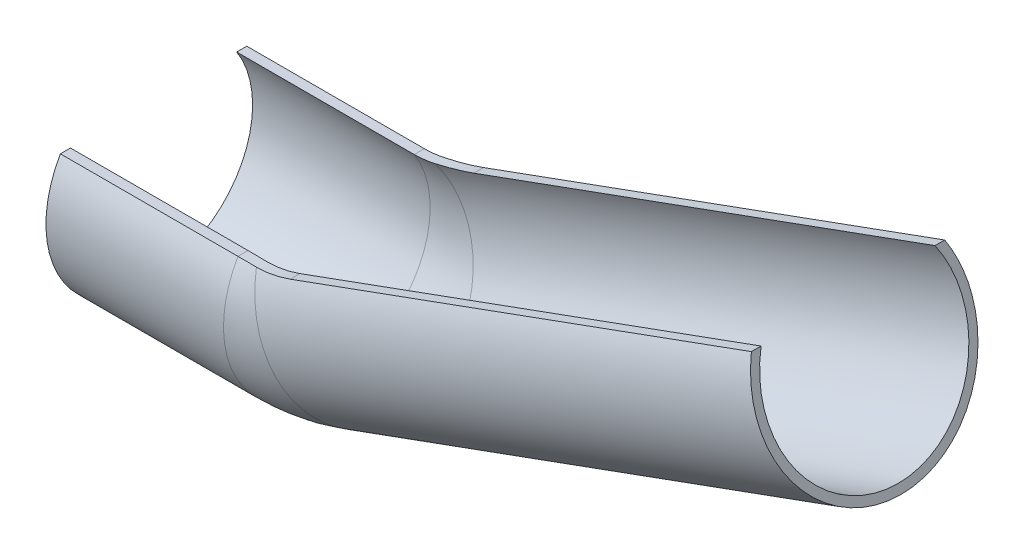
ISO-10303-21;
HEADER;
FILE_DESCRIPTION(('STEP AP214'),'2;1');
FILE_NAME('part.step','',(''),(''),'','','');
FILE_SCHEMA(('AUTOMOTIVE_DESIGN { 1 0 10303 214 1 1 1 1 }'));
ENDSEC;
DATA;
#1=APPLICATION_CONTEXT('core data for automotive mechanical design processes');
#2=APPLICATION_PROTOCOL_DEFINITION('international standard','automotive_design',2000,#1);
#3=PRODUCT_CONTEXT('',#1,'mechanical');
#4=PRODUCT('Part','Part','',(#3));
#5=PRODUCT_RELATED_PRODUCT_CATEGORY('part','',(#4));
#6=PRODUCT_DEFINITION_FORMATION('','',#4);
#7=PRODUCT_DEFINITION_CONTEXT('part definition',#1,'design');
#8=PRODUCT_DEFINITION('design','',#6,#7);
#9=PRODUCT_DEFINITION_SHAPE('','',#8);
#10=(LENGTH_UNIT() NAMED_UNIT(*) SI_UNIT(.MILLI.,.METRE.));
#11=(NAMED_UNIT(*) PLANE_ANGLE_UNIT() SI_UNIT($,.RADIAN.));
#12=(NAMED_UNIT(*) SI_UNIT($,.STERADIAN.) SOLID_ANGLE_UNIT());
#13=UNCERTAINTY_MEASURE_WITH_UNIT(LENGTH_MEASURE(1.E-05),#10,'distance_accuracy_value','');
#14=(GEOMETRIC_REPRESENTATION_CONTEXT(3) GLOBAL_UNCERTAINTY_ASSIGNED_CONTEXT((#13)) GLOBAL_UNIT_ASSIGNED_CONTEXT((#10,
#11,#12)) REPRESENTATION_CONTEXT('',''));
#15=CARTESIAN_POINT('',(0.,0.,0.));
#16=DIRECTION('',(0.,0.,1.));
#17=DIRECTION('',(1.,0.,0.));
#18=AXIS2_PLACEMENT_3D('',#15,#16,#17);
#19=CARTESIAN_POINT('',(0.,0.,0.));
#20=DIRECTION('',(1.,0.,0.));
#21=DIRECTION('',(0.,0.,-1.));
#22=AXIS2_PLACEMENT_3D('',#19,#20,#21);
#23=PLANE('',#22);
#24=DIRECTION('',(0.,0.,-1.));
#25=VECTOR('',#24,1.);
#26=CARTESIAN_POINT('',(0.,12.500000019,-41.5198482362227));
#27=LINE('',#26,#25);
#28=CARTESIAN_POINT('',(0.,12.500000019,-19.3067345330328));
#29=VERTEX_POINT('',#28);
#30=CARTESIAN_POINT('',(0.,12.500000019,-21.6506351275199));
#31=VERTEX_POINT('',#30);
#32=EDGE_CURVE('E233',#29,#31,#27,.T.);
#33=ORIENTED_EDGE('',*,*,#32,.T.);
#34=CARTESIAN_POINT('',(0.,0.,0.));
#35=DIRECTION('',(1.,0.,0.));
#36=DIRECTION('',(0.,0.,-1.));
#37=AXIS2_PLACEMENT_3D('',#34,#35,#36);
#38=CIRCLE('',#37,25.000000038);
#39=CARTESIAN_POINT('',(0.,0.,-25.000000038));
#40=VERTEX_POINT('',#39);
#41=EDGE_CURVE('E236',#40,#31,#38,.T.);
#42=ORIENTED_EDGE('',*,*,#41,.F.);
#43=CARTESIAN_POINT('',(0.,12.500000019,21.6506351275199));
#44=VERTEX_POINT('',#43);
#45=EDGE_CURVE('E249',#44,#40,#38,.T.);
#46=ORIENTED_EDGE('',*,*,#45,.F.);
#47=DIRECTION('',(0.,0.,-1.));
#48=VECTOR('',#47,1.);
#49=CARTESIAN_POINT('',(0.,12.500000019,41.5198482362227));
#50=LINE('',#49,#48);
#51=CARTESIAN_POINT('',(0.,12.500000019,19.3067345330328));
#52=VERTEX_POINT('',#51);
#53=EDGE_CURVE('E134',#44,#52,#50,.T.);
#54=ORIENTED_EDGE('',*,*,#53,.T.);
#55=CARTESIAN_POINT('',(0.,0.,0.));
#56=DIRECTION('',(1.,0.,0.));
#57=DIRECTION('',(0.,0.,-1.));
#58=AXIS2_PLACEMENT_3D('',#55,#56,#57);
#59=CIRCLE('',#58,22.999999974);
#60=EDGE_CURVE('E239',#52,#29,#59,.T.);
#61=ORIENTED_EDGE('',*,*,#60,.T.);
#62=EDGE_LOOP('',(#33,#42,#46,#54,#61));
#63=FACE_BOUND('',#62,.T.);
#64=ADVANCED_FACE('F32',(#63),#23,.F.);
#65=CARTESIAN_POINT('',(165.06096283981,43.43655820236,0.));
#66=DIRECTION('',(0.939692620785908,0.342020143325669,0.));
#67=DIRECTION('',(0.,0.,-1.));
#68=AXIS2_PLACEMENT_3D('',#65,#66,#67);
#69=PLANE('',#68);
#70=CARTESIAN_POINT('',(165.06096283981,43.43655820236,0.));
#71=DIRECTION('',(0.939692620785908,0.342020143325669,0.));
#72=DIRECTION('',(0.,0.,-1.));
#73=AXIS2_PLACEMENT_3D('',#70,#71,#72);
#74=CIRCLE('',#73,25.000000038);
#75=CARTESIAN_POINT('',(165.06096283981,43.43655820236,-25.000000038));
#76=VERTEX_POINT('',#75);
#77=CARTESIAN_POINT('',(161.301369504585,53.7659559972241,-22.453707957689));
#78=VERTEX_POINT('',#77);
#79=EDGE_CURVE('E127',#76,#78,#74,.T.);
#80=ORIENTED_EDGE('',*,*,#79,.T.);
#81=DIRECTION('',(0.,0.,1.));
#82=VECTOR('',#81,1.);
#83=CARTESIAN_POINT('',(161.301369504585,53.7659559972241,0.));
#84=LINE('',#83,#82);
#85=CARTESIAN_POINT('',(161.301369504585,53.7659559972241,-20.2031927663225));
#86=VERTEX_POINT('',#85);
#87=EDGE_CURVE('E266',#78,#86,#84,.T.);
#88=ORIENTED_EDGE('',*,*,#87,.T.);
#89=CARTESIAN_POINT('',(165.06096283981,43.43655820236,0.));
#90=DIRECTION('',(0.939692620785908,0.342020143325669,0.));
#91=DIRECTION('',(-0.342020143325669,0.939692620785908,0.));
#92=AXIS2_PLACEMENT_3D('',#89,#90,#91);
#93=CIRCLE('',#92,22.999999974);
#94=CARTESIAN_POINT('',(161.301369504585,53.7659559972241,20.2031927663225));
#95=VERTEX_POINT('',#94);
#96=EDGE_CURVE('E254',#95,#86,#93,.T.);
#97=ORIENTED_EDGE('',*,*,#96,.F.);
#98=DIRECTION('',(0.,0.,1.));
#99=VECTOR('',#98,1.);
#100=CARTESIAN_POINT('',(161.301369504585,53.7659559972241,0.));
#101=LINE('',#100,#99);
#102=CARTESIAN_POINT('',(161.301369504585,53.7659559972241,22.453707957689));
#103=VERTEX_POINT('',#102);
#104=EDGE_CURVE('E59',#95,#103,#101,.T.);
#105=ORIENTED_EDGE('',*,*,#104,.T.);
#106=EDGE_CURVE('E259',#103,#76,#74,.T.);
#107=ORIENTED_EDGE('',*,*,#106,.T.);
#108=EDGE_LOOP('',(#80,#88,#97,#105,#107));
#109=FACE_BOUND('',#108,.T.);
#110=ADVANCED_FACE('F189',(#109),#69,.T.);
#111=CARTESIAN_POINT('',(0.,0.,0.));
#112=DIRECTION('',(1.,0.,0.));
#113=DIRECTION('',(0.,0.,-1.));
#114=AXIS2_PLACEMENT_3D('',#111,#112,#113);
#115=CYLINDRICAL_SURFACE('',#114,25.000000038);
#116=ORIENTED_EDGE('',*,*,#41,.T.);
#117=DIRECTION('',(1.,0.,0.));
#118=VECTOR('',#117,1.);
#119=CARTESIAN_POINT('',(0.,12.500000019,-21.6506351275199));
#120=LINE('',#119,#118);
#121=CARTESIAN_POINT('',(41.241294690005,12.500000019,-21.6506351275199));
#122=VERTEX_POINT('',#121);
#123=EDGE_CURVE('E246',#31,#122,#120,.T.);
#124=ORIENTED_EDGE('',*,*,#123,.T.);
#125=CARTESIAN_POINT('',(41.241294690005,0.,0.));
#126=DIRECTION('',(1.,0.,0.));
#127=DIRECTION('',(0.,0.,-1.));
#128=AXIS2_PLACEMENT_3D('',#125,#126,#127);
#129=CIRCLE('',#128,25.000000038);
#130=CARTESIAN_POINT('',(41.241294690005,12.500000019,21.6506351275199));
#131=VERTEX_POINT('',#130);
#132=EDGE_CURVE('E250',#131,#122,#129,.T.);
#133=ORIENTED_EDGE('',*,*,#132,.F.);
#134=DIRECTION('',(1.,0.,0.));
#135=VECTOR('',#134,1.);
#136=CARTESIAN_POINT('',(0.,12.500000019,21.6506351275199));
#137=LINE('',#136,#135);
#138=EDGE_CURVE('E292',#131,#44,#137,.F.);
#139=ORIENTED_EDGE('',*,*,#138,.T.);
#140=ORIENTED_EDGE('',*,*,#45,.T.);
#141=EDGE_LOOP('',(#116,#124,#133,#139,#140));
#142=FACE_BOUND('',#141,.T.);
#143=ADVANCED_FACE('F228',(#142),#115,.T.);
#144=CARTESIAN_POINT('',(41.241294690005,25.4,0.));
#145=DIRECTION('',(0.,0.,1.));
#146=DIRECTION('',(1.,0.,0.));
#147=AXIS2_PLACEMENT_3D('',#144,#145,#146);
#148=TOROIDAL_SURFACE('',#147,25.4,25.000000038);
#149=ORIENTED_EDGE('',*,*,#132,.T.);
#150=CARTESIAN_POINT('',(41.241094690005,12.5000000195277,-21.6506351281104));
#151=CARTESIAN_POINT('',(41.4427943706506,12.4999985460245,-21.6506284967694));
#152=CARTESIAN_POINT('',(41.6444860700395,12.5016081439898,-21.6524350423005));
#153=CARTESIAN_POINT('',(42.0477496703757,12.5080445159722,-21.659626196609));
#154=CARTESIAN_POINT('',(42.249321574054,12.5128712135947,-21.6650107204223));
#155=CARTESIAN_POINT('',(42.8535654704319,12.5321648074768,-21.6864536078516));
#156=CARTESIAN_POINT('',(43.2559167143779,12.5514452119231,-21.7078013556818));
#157=CARTESIAN_POINT('',(44.0580307932106,12.6026826372822,-21.7635823664135));
#158=CARTESIAN_POINT('',(44.4577972597128,12.6346133675283,-21.7979884844348));
#159=CARTESIAN_POINT('',(45.2549735131758,12.710999938781,-21.8784186799537));
#160=CARTESIAN_POINT('',(45.6523831377384,12.7554566328818,-21.9244435487366));
#161=CARTESIAN_POINT('',(46.4393849390073,12.8560887766978,-22.0256735392643));
#162=CARTESIAN_POINT('',(46.8290127036205,12.9121105845886,-22.0807565465443));
#163=CARTESIAN_POINT('',(47.6051917313379,13.0360431324913,-22.1986103163941));
#164=CARTESIAN_POINT('',(47.991742981191,13.1039539236822,-22.2613811120573));
#165=CARTESIAN_POINT('',(48.7616868037057,13.2515492440647,-22.3927197126638));
#166=CARTESIAN_POINT('',(49.1450785963947,13.3312365937245,-22.4612889046268));
#167=CARTESIAN_POINT('',(49.9085195662318,13.5022732742946,-22.6023763566848));
#168=CARTESIAN_POINT('',(50.2885687152517,13.59362270324,-22.6748946499743));
#169=CARTESIAN_POINT('',(50.9653457116278,13.7673947596919,-22.8066223872954));
#170=CARTESIAN_POINT('',(51.2627208056376,13.8476288326402,-22.8654084092339));
#171=CARTESIAN_POINT('',(51.8552256671921,14.0152610495599,-22.9835939462965));
#172=CARTESIAN_POINT('',(52.1503560693851,14.102657079572,-23.0429932759018));
#173=CARTESIAN_POINT('',(52.7398874723188,14.2850716388282,-23.1620111414719));
#174=CARTESIAN_POINT('',(53.0342774177764,14.38012615066,-23.2216292854271));
#175=CARTESIAN_POINT('',(53.6208566668701,14.5774902771238,-23.3401681598754));
#176=CARTESIAN_POINT('',(53.9130452959232,14.6798020230549,-23.3990886795129));
#177=CARTESIAN_POINT('',(54.2040581285462,14.7857224870428,-23.4573332485608));
#178=B_SPLINE_CURVE_WITH_KNOTS('',3,(#150,#151,#152,#153,#154,#155,#156,#157,#158,#159,#160,
#161,#162,#163,#164,#165,#166,#167,#168,#169,#170,#171,#172,#173,#174,#175,#176,#177),
.UNSPECIFIED.,.F.,.F.,(4,2,2,2,2,2,2,2,2,2,2,2,2,4),(0.,0.60506888105471,1.21012339439529,
2.4197796903958,3.62693508391552,4.83417271192954,6.02630001501243,7.21843245001157,
8.41085086305313,9.60327930059911,10.5438984734107,11.4842410014645,12.4292929055854,
13.3746235102097),.UNSPECIFIED.);
#179=CARTESIAN_POINT('',(45.8348174428094,12.779399960919,-21.9484067017966));
#180=VERTEX_POINT('',#179);
#181=EDGE_CURVE('E199',#122,#180,#178,.T.);
#182=ORIENTED_EDGE('',*,*,#181,.T.);
#183=CARTESIAN_POINT('',(49.928606330477,1.53180743203794,0.));
#184=DIRECTION('',(0.939692620785908,0.34202014332567,0.));
#185=DIRECTION('',(0.,0.,-1.));
#186=AXIS2_PLACEMENT_3D('',#183,#184,#185);
#187=CIRCLE('',#186,25.000000038);
#188=CARTESIAN_POINT('',(45.8348174428094,12.779399960919,21.9484067017966));
#189=VERTEX_POINT('',#188);
#190=EDGE_CURVE('E252',#189,#180,#187,.T.);
#191=ORIENTED_EDGE('',*,*,#190,.F.);
#192=CARTESIAN_POINT('',(54.2040581285462,14.7857224870427,23.4573332485608));
#193=CARTESIAN_POINT('',(53.98545081434,14.7061549297537,23.4135739348244));
#194=CARTESIAN_POINT('',(53.7661822888361,14.6286253047369,23.3694410999807));
#195=CARTESIAN_POINT('',(53.3263466636408,14.4776450593815,23.2806852494218));
#196=CARTESIAN_POINT('',(53.1057795782473,14.4041943942242,23.2360622390991));
#197=CARTESIAN_POINT('',(52.4421386217931,14.1899564060312,23.1018376426423));
#198=CARTESIAN_POINT('',(51.9971452171649,14.0552904294496,23.011884574353));
#199=CARTESIAN_POINT('',(51.1006537325067,13.8019023062433,22.8330994247237));
#200=CARTESIAN_POINT('',(50.6491382454345,13.6832380719747,22.7442724164352));
#201=CARTESIAN_POINT('',(49.7413320567791,13.4625170032448,22.5708088307404));
#202=CARTESIAN_POINT('',(49.2850415133641,13.3604596205423,22.4861721150643));
#203=CARTESIAN_POINT('',(47.9272728017618,13.0831232484687,22.2463179521221));
#204=CARTESIAN_POINT('',(47.0188039579276,12.9315711630488,22.1013169092726));
#205=CARTESIAN_POINT('',(45.6455948176543,12.7539532509184,21.9230623728855));
#206=CARTESIAN_POINT('',(45.1864582210233,12.7030520465176,21.8702105089012));
#207=CARTESIAN_POINT('',(44.2651250481439,12.6179898357447,21.7802689622773));
#208=CARTESIAN_POINT('',(43.8029292848401,12.5838245497551,21.7431752503715));
#209=CARTESIAN_POINT('',(43.1655894457361,12.5484802219718,21.7044305650613));
#210=CARTESIAN_POINT('',(42.9912676924537,12.5400200615466,21.6951057744851));
#211=CARTESIAN_POINT('',(42.6423939753386,12.5255047129273,21.679053656971));
#212=CARTESIAN_POINT('',(42.4678420038181,12.5194496071975,21.6723264190978));
#213=CARTESIAN_POINT('',(42.1179600398646,12.5097348294756,21.6615133197201));
#214=CARTESIAN_POINT('',(41.9426295111612,12.5060838717812,21.6574370678784));
#215=CARTESIAN_POINT('',(41.5918978757429,12.5012158156591,21.651995417976));
#216=CARTESIAN_POINT('',(41.4164967712649,12.4999986453669,21.650629939872));
#217=CARTESIAN_POINT('',(41.241094690005,12.5000000195277,21.6506351281104));
#218=B_SPLINE_CURVE_WITH_KNOTS('',3,(#192,#193,#194,#195,#196,#197,#198,#199,#200,#201,#202,
#203,#204,#205,#206,#207,#208,#209,#210,#211,#212,#213,#214,#215,#216,#217),.UNSPECIFIED.,.F.,
.F.,(4,2,2,2,2,2,2,2,2,2,2,2,4),(0.,0.710131370374318,1.42025493644271,2.84056756595822,
4.26588991215461,5.69116519470598,8.48428148632823,9.87873462987022,11.2728310050908,
11.7971332775622,12.3214535257094,12.8476639626998,13.3738588616178),.UNSPECIFIED.);
#219=EDGE_CURVE('E175',#189,#131,#218,.T.);
#220=ORIENTED_EDGE('',*,*,#219,.T.);
#221=EDGE_LOOP('',(#149,#182,#191,#220));
#222=FACE_BOUND('',#221,.T.);
#223=ADVANCED_FACE('F186',(#222),#148,.T.);
#224=CARTESIAN_POINT('',(49.928606330477,1.53180743203794,0.));
#225=DIRECTION('',(0.939692620785908,0.342020143325669,0.));
#226=DIRECTION('',(-0.342020143325669,0.939692620785908,0.));
#227=AXIS2_PLACEMENT_3D('',#224,#225,#226);
#228=CYLINDRICAL_SURFACE('',#227,25.000000038);
#229=ORIENTED_EDGE('',*,*,#190,.T.);
#230=CARTESIAN_POINT('',(45.8348174428094,12.779399960919,-21.9484067017966));
#231=CARTESIAN_POINT('',(46.1904527280825,12.8228214071803,-21.9924800796373));
#232=CARTESIAN_POINT('',(46.5458368580741,12.8713348368403,-22.0333341920584));
#233=CARTESIAN_POINT('',(47.2557116257337,12.9785406857696,-22.1089068111397));
#234=CARTESIAN_POINT('',(47.6102022879032,13.037232822759,-22.1436254878963));
#235=CARTESIAN_POINT('',(48.6687715349339,13.2280321681227,-22.2387660001439));
#236=CARTESIAN_POINT('',(49.3709741957765,13.3752315147464,-22.2905412548036));
#237=CARTESIAN_POINT('',(50.7670317225234,13.7095986664557,-22.3727095697767));
#238=CARTESIAN_POINT('',(51.4608867829153,13.8967655384408,-22.403103129206));
#239=CARTESIAN_POINT('',(52.4945915211011,14.207410088907,-22.4334836526156));
#240=CARTESIAN_POINT('',(52.8387026008838,14.3162034394961,-22.4410753580652));
#241=CARTESIAN_POINT('',(53.5237429501752,14.5435959486354,-22.4511842074946));
#242=CARTESIAN_POINT('',(53.8646722352511,14.6621950591817,-22.4537013763151));
#243=CARTESIAN_POINT('',(54.2038581285462,14.7856496923599,-22.453707957689));
#244=B_SPLINE_CURVE_WITH_KNOTS('',3,(#230,#231,#232,#233,#234,#235,#236,#237,#238,#239,#240,
#241,#242,#243),.UNSPECIFIED.,.F.,.F.,(4,2,2,2,2,2,4),(0.,1.08282716137683,2.1656242981641,
4.32202220074594,6.47836976455232,7.56114772918094,8.6439203934196),.UNSPECIFIED.);
#245=CARTESIAN_POINT('',(54.2038581285462,14.7856496923599,-22.453707957689));
#246=VERTEX_POINT('',#245);
#247=EDGE_CURVE('E192',#180,#246,#244,.T.);
#248=ORIENTED_EDGE('',*,*,#247,.T.);
#249=DIRECTION('',(0.939692620785908,0.342020143325669,0.));
#250=VECTOR('',#249,1.);
#251=CARTESIAN_POINT('',(46.1690129952515,11.861205226902,-22.453707957689));
#252=LINE('',#251,#250);
#253=EDGE_CURVE('E265',#246,#78,#252,.T.);
#254=ORIENTED_EDGE('',*,*,#253,.T.);
#255=ORIENTED_EDGE('',*,*,#79,.F.);
#256=ORIENTED_EDGE('',*,*,#106,.F.);
#257=DIRECTION('',(0.939692620785908,0.342020143325669,0.));
#258=VECTOR('',#257,1.);
#259=CARTESIAN_POINT('',(46.1690129952515,11.861205226902,22.453707957689));
#260=LINE('',#259,#258);
#261=CARTESIAN_POINT('',(54.2038581285462,14.7856496923599,22.453707957689));
#262=VERTEX_POINT('',#261);
#263=EDGE_CURVE('E267',#103,#262,#260,.F.);
#264=ORIENTED_EDGE('',*,*,#263,.T.);
#265=CARTESIAN_POINT('',(54.2038581285462,14.7856496923599,22.453707957689));
#266=CARTESIAN_POINT('',(53.8646722352511,14.6621950591817,22.453701376315));
#267=CARTESIAN_POINT('',(53.5237429501752,14.5435959486354,22.4511842074946));
#268=CARTESIAN_POINT('',(52.8387026008838,14.3162034394961,22.4410753580652));
#269=CARTESIAN_POINT('',(52.4945915211011,14.207410088907,22.4334836526156));
#270=CARTESIAN_POINT('',(51.4608867829153,13.8967655384407,22.403103129206));
#271=CARTESIAN_POINT('',(50.7670317225234,13.7095986664557,22.3727095697767));
#272=CARTESIAN_POINT('',(49.3709741957765,13.3752315147463,22.2905412548036));
#273=CARTESIAN_POINT('',(48.6687715349339,13.2280321681227,22.2387660001439));
#274=CARTESIAN_POINT('',(47.6102022879032,13.037232822759,22.1436254878963));
#275=CARTESIAN_POINT('',(47.2557116257338,12.9785406857696,22.1089068111397));
#276=CARTESIAN_POINT('',(46.5458368580741,12.8713348368403,22.0333341920584));
#277=CARTESIAN_POINT('',(46.1904527280825,12.8228214071803,21.9924800796374));
#278=CARTESIAN_POINT('',(45.8348174428094,12.779399960919,21.9484067017967));
#279=B_SPLINE_CURVE_WITH_KNOTS('',3,(#265,#266,#267,#268,#269,#270,#271,#272,#273,#274,#275,
#276,#277,#278),.UNSPECIFIED.,.F.,.F.,(4,2,2,2,2,2,4),(0.,1.08277266423865,2.16555062886727,
4.32189819267364,6.4782960952555,7.56109323204277,8.64392039341959),.UNSPECIFIED.);
#280=EDGE_CURVE('E133',#262,#189,#279,.T.);
#281=ORIENTED_EDGE('',*,*,#280,.T.);
#282=EDGE_LOOP('',(#229,#248,#254,#255,#256,#264,#281));
#283=FACE_BOUND('',#282,.T.);
#284=ADVANCED_FACE('F182',(#283),#228,.T.);
#285=CARTESIAN_POINT('',(0.,0.,0.));
#286=DIRECTION('',(1.,0.,0.));
#287=DIRECTION('',(0.,0.,-1.));
#288=AXIS2_PLACEMENT_3D('',#285,#286,#287);
#289=CYLINDRICAL_SURFACE('',#288,22.999999974);
#290=DIRECTION('',(1.,0.,0.));
#291=VECTOR('',#290,1.);
#292=CARTESIAN_POINT('',(0.,12.500000019,-19.3067345330328));
#293=LINE('',#292,#291);
#294=CARTESIAN_POINT('',(41.241294690005,12.500000019,-19.3067345330328));
#295=VERTEX_POINT('',#294);
#296=EDGE_CURVE('E285',#29,#295,#293,.T.);
#297=ORIENTED_EDGE('',*,*,#296,.F.);
#298=ORIENTED_EDGE('',*,*,#60,.F.);
#299=DIRECTION('',(1.,0.,0.));
#300=VECTOR('',#299,1.);
#301=CARTESIAN_POINT('',(0.,12.500000019,19.3067345330328));
#302=LINE('',#301,#300);
#303=CARTESIAN_POINT('',(41.241294690005,12.500000019,19.3067345330328));
#304=VERTEX_POINT('',#303);
#305=EDGE_CURVE('E283',#304,#52,#302,.F.);
#306=ORIENTED_EDGE('',*,*,#305,.F.);
#307=CARTESIAN_POINT('',(41.241294690005,0.,0.));
#308=DIRECTION('',(-1.,0.,0.));
#309=DIRECTION('',(0.,-1.,0.));
#310=AXIS2_PLACEMENT_3D('',#307,#308,#309);
#311=CIRCLE('',#310,22.999999974);
#312=EDGE_CURVE('E286',#304,#295,#311,.F.);
#313=ORIENTED_EDGE('',*,*,#312,.T.);
#314=EDGE_LOOP('',(#297,#298,#306,#313));
#315=FACE_BOUND('',#314,.T.);
#316=ADVANCED_FACE('F185',(#315),#289,.F.);
#317=CARTESIAN_POINT('',(41.241294690005,25.4,0.));
#318=DIRECTION('',(0.,0.,1.));
#319=DIRECTION('',(1.,0.,0.));
#320=AXIS2_PLACEMENT_3D('',#317,#318,#319);
#321=TOROIDAL_SURFACE('',#320,25.4,22.999999974);
#322=CARTESIAN_POINT('',(41.241094690005,12.5000000195277,-19.3067345336949));
#323=CARTESIAN_POINT('',(41.4341094722196,12.4999985682111,-19.3067278529148));
#324=CARTESIAN_POINT('',(41.627116256437,12.501472559868,-19.3085827556204));
#325=CARTESIAN_POINT('',(42.0130095802574,12.5073663222799,-19.3159676379453));
#326=CARTESIAN_POINT('',(42.2058961228897,12.5117860155473,-19.3214975208928));
#327=CARTESIAN_POINT('',(42.7840748360402,12.5294512335544,-19.3435215843481));
#328=CARTESIAN_POINT('',(43.1690458681475,12.5471029046861,-19.3654502546361));
#329=CARTESIAN_POINT('',(43.9362915766139,12.5939901820361,-19.4227712090997));
#330=CARTESIAN_POINT('',(44.3185705494892,12.6231972838791,-19.4581303551186));
#331=CARTESIAN_POINT('',(45.08079516112,12.6930415519902,-19.5408540976727));
#332=CARTESIAN_POINT('',(45.4607406167249,12.7336796040142,-19.5882196245244));
#333=CARTESIAN_POINT('',(46.2131216004219,12.8256364544952,-19.6925163004559));
#334=CARTESIAN_POINT('',(46.5855918104177,12.8768164364459,-19.7493214364343));
#335=CARTESIAN_POINT('',(47.3275404793247,12.9899954346618,-19.8710238904937));
#336=CARTESIAN_POINT('',(47.6970189380963,13.0519944514322,-19.9359212089524));
#337=CARTESIAN_POINT('',(48.433004140811,13.1867049435899,-20.0719424342535));
#338=CARTESIAN_POINT('',(48.7995096826068,13.2594205447963,-20.1430687349171));
#339=CARTESIAN_POINT('',(49.5293757492829,13.4154494659067,-20.2897055819121));
#340=CARTESIAN_POINT('',(49.8927362092529,13.4987630039835,-20.3652162184835));
#341=CARTESIAN_POINT('',(50.5881549773979,13.6690295969202,-20.5129457157873));
#342=CARTESIAN_POINT('',(50.9204493534359,13.7551952949016,-20.5849636641614));
#343=CARTESIAN_POINT('',(51.5822448458837,13.9364235324167,-20.7300499947722));
#344=CARTESIAN_POINT('',(51.9117468712951,14.0314830450624,-20.803118012518));
#345=CARTESIAN_POINT('',(52.5699678828871,14.2310888117093,-20.9496516380394));
#346=CARTESIAN_POINT('',(52.8986711293283,14.3356870975153,-21.0231170826975));
#347=CARTESIAN_POINT('',(53.5534087660137,14.5539275659521,-21.1690709974885));
#348=CARTESIAN_POINT('',(53.8794422163348,14.6675727943929,-21.2415591289055));
#349=CARTESIAN_POINT('',(54.2040581285462,14.7857224870428,-21.3130589085198));
#350=B_SPLINE_CURVE_WITH_KNOTS('',3,(#322,#323,#324,#325,#326,#327,#328,#329,#330,#331,#332,
#333,#334,#335,#336,#337,#338,#339,#340,#341,#342,#343,#344,#345,#346,#347,#348,#349),
.UNSPECIFIED.,.F.,.F.,(4,2,2,2,2,2,2,2,2,2,2,2,2,4),(0.,0.579014144082035,1.15801305758065,
2.31553207236462,3.47021340205716,4.6249842297976,5.765423378115,6.90586257968811,
8.04674199589081,9.18764490243069,10.2397911319551,11.2915805715438,12.3494963036683,
13.4077697200783),.UNSPECIFIED.);
#351=CARTESIAN_POINT('',(45.8348174428094,12.779399960919,-19.640075194649));
#352=VERTEX_POINT('',#351);
#353=EDGE_CURVE('E200',#295,#352,#350,.T.);
#354=ORIENTED_EDGE('',*,*,#353,.F.);
#355=ORIENTED_EDGE('',*,*,#312,.F.);
#356=CARTESIAN_POINT('',(54.2040581285462,14.7857224870427,21.3130589085198));
#357=CARTESIAN_POINT('',(53.9908574653532,14.7081228634511,21.2660880972312));
#358=CARTESIAN_POINT('',(53.7770457020017,14.6324679672078,21.2187031544992));
#359=CARTESIAN_POINT('',(53.348215337185,14.4850465264771,21.1233625944869));
#360=CARTESIAN_POINT('',(53.1331967508818,14.4132799332589,21.0754069843678));
#361=CARTESIAN_POINT('',(52.4863278582002,14.2038023117185,20.9310647444834));
#362=CARTESIAN_POINT('',(52.0526821205185,14.071919883667,20.8342066474767));
#363=CARTESIAN_POINT('',(51.1790167033891,13.8232486241692,20.6412477516989));
#364=CARTESIAN_POINT('',(50.7389788714279,13.7065200735819,20.5451513243454));
#365=CARTESIAN_POINT('',(49.854248749008,13.4888280550953,20.3568896239138));
#366=CARTESIAN_POINT('',(49.4095565999178,13.387864109842,20.264724231865));
#367=CARTESIAN_POINT('',(48.0869222749477,13.1126451339369,20.0024563838071));
#368=CARTESIAN_POINT('',(47.2020112010188,12.9608274668453,19.8422673905454));
#369=CARTESIAN_POINT('',(45.8633576463811,12.7802067081837,19.6416995612969));
#370=CARTESIAN_POINT('',(45.4156303854334,12.7278744077837,19.5814960315644));
#371=CARTESIAN_POINT('',(44.5167510909357,12.6391050237147,19.4773138180076));
#372=CARTESIAN_POINT('',(44.0656000014839,12.6026637094303,19.4333308163162));
#373=CARTESIAN_POINT('',(43.4166570180316,12.5619683604437,19.3836386945456));
#374=CARTESIAN_POINT('',(43.2198166887837,12.5511643265295,19.3703489080103));
#375=CARTESIAN_POINT('',(42.8257598845291,12.53262131676,19.3474398184017));
#376=CARTESIAN_POINT('',(42.6285433864583,12.5248825353405,19.3378207481715));
#377=CARTESIAN_POINT('',(42.2330259380891,12.5124587906488,19.3223403044531));
#378=CARTESIAN_POINT('',(42.0347239445716,12.5077869641907,19.3164950974498));
#379=CARTESIAN_POINT('',(41.6379801227206,12.5015564792479,19.3086873217925));
#380=CARTESIAN_POINT('',(41.4395382850982,12.4999980519277,19.3067250414393));
#381=CARTESIAN_POINT('',(41.2410946900049,12.5000000195277,19.3067345336951));
#382=B_SPLINE_CURVE_WITH_KNOTS('',3,(#356,#357,#358,#359,#360,#361,#362,#363,#364,#365,#366,
#367,#368,#369,#370,#371,#372,#373,#374,#375,#376,#377,#378,#379,#380,#381),.UNSPECIFIED.,.F.,
.F.,(4,2,2,2,2,2,2,2,2,2,2,2,4),(0.,0.695065472286207,1.39012223155588,2.78029345589103,
4.17583545040279,5.57133517955378,8.30359761666693,9.66749387801715,11.0310268108279,
11.6237342309969,12.2164792419017,12.8117468971736,13.4070587483932),.UNSPECIFIED.);
#383=CARTESIAN_POINT('',(45.8348174428094,12.779399960919,19.640075194649));
#384=VERTEX_POINT('',#383);
#385=EDGE_CURVE('E163',#384,#304,#382,.T.);
#386=ORIENTED_EDGE('',*,*,#385,.F.);
#387=CARTESIAN_POINT('',(49.928606330477,1.53180743203794,0.));
#388=DIRECTION('',(0.939692620785908,0.342020143325669,0.));
#389=DIRECTION('',(-0.342020143325669,0.939692620785908,0.));
#390=AXIS2_PLACEMENT_3D('',#387,#388,#389);
#391=CIRCLE('',#390,22.999999974);
#392=EDGE_CURVE('E140',#384,#352,#391,.T.);
#393=ORIENTED_EDGE('',*,*,#392,.T.);
#394=EDGE_LOOP('',(#354,#355,#386,#393));
#395=FACE_BOUND('',#394,.T.);
#396=ADVANCED_FACE('F308',(#395),#321,.F.);
#397=CARTESIAN_POINT('',(49.928606330477,1.53180743203794,0.));
#398=DIRECTION('',(0.939692620785908,0.342020143325669,0.));
#399=DIRECTION('',(-0.342020143325669,0.939692620785908,0.));
#400=AXIS2_PLACEMENT_3D('',#397,#398,#399);
#401=CYLINDRICAL_SURFACE('',#400,22.999999974);
#402=CARTESIAN_POINT('',(45.8348174428094,12.779399960919,-19.640075194649));
#403=CARTESIAN_POINT('',(46.1900257524837,12.8227667255997,-19.6892675051314));
#404=CARTESIAN_POINT('',(46.5451019925654,12.8712322605631,-19.7348533395283));
#405=CARTESIAN_POINT('',(47.2545203833224,12.9783524067294,-19.8191518289833));
#406=CARTESIAN_POINT('',(47.6088625600173,13.0370066503041,-19.8578647319281));
#407=CARTESIAN_POINT('',(48.3148337711605,13.1642223096308,-19.9286068363823));
#408=CARTESIAN_POINT('',(48.6664679069017,13.2327396379423,-19.9606643071542));
#409=CARTESIAN_POINT('',(49.3681226710556,13.3798271053116,-20.0185762542883));
#410=CARTESIAN_POINT('',(49.7181432853805,13.4583973319703,-20.0444306765915));
#411=CARTESIAN_POINT('',(50.7651816929101,13.7091237292665,-20.1130465031442));
#412=CARTESIAN_POINT('',(51.4592976128866,13.8963174988427,-20.146872451246));
#413=CARTESIAN_POINT('',(52.493480809217,14.2070615046028,-20.1806844911825));
#414=CARTESIAN_POINT('',(52.8378048251013,14.3159120181593,-20.1891338217062));
#415=CARTESIAN_POINT('',(53.5232825791333,14.543436560454,-20.2003840762692));
#416=CARTESIAN_POINT('',(53.8644363381776,14.6621105243902,-20.2031850375658));
#417=CARTESIAN_POINT('',(54.2038581285462,14.7856496923599,-20.2031927663225));
#418=B_SPLINE_CURVE_WITH_KNOTS('',3,(#402,#403,#404,#405,#406,#407,#408,#409,#410,#411,#412,
#413,#414,#415,#416,#417),.UNSPECIFIED.,.F.,.F.,(4,2,2,2,2,2,2,4),(0.,1.08356534009281,
2.16709159118623,3.24591684403701,4.32475149840167,6.48204920949886,7.56555045023007,
8.64904454402288),.UNSPECIFIED.);
#419=CARTESIAN_POINT('',(54.2038581285462,14.7856496923599,-20.2031927663225));
#420=VERTEX_POINT('',#419);
#421=EDGE_CURVE('E11',#352,#420,#418,.T.);
#422=ORIENTED_EDGE('',*,*,#421,.F.);
#423=ORIENTED_EDGE('',*,*,#392,.F.);
#424=CARTESIAN_POINT('',(54.2038581285462,14.7856496923599,20.2031927663225));
#425=CARTESIAN_POINT('',(53.8644363381776,14.6621105243902,20.2031850375658));
#426=CARTESIAN_POINT('',(53.5232825791333,14.543436560454,20.2003840762692));
#427=CARTESIAN_POINT('',(52.8378048251013,14.3159120181592,20.1891338217062));
#428=CARTESIAN_POINT('',(52.4934808092171,14.2070615046028,20.1806844911825));
#429=CARTESIAN_POINT('',(51.4592976128866,13.8963174988426,20.146872451246));
#430=CARTESIAN_POINT('',(50.7651816929101,13.7091237292664,20.1130465031442));
#431=CARTESIAN_POINT('',(49.7181432853805,13.4583973319703,20.0444306765915));
#432=CARTESIAN_POINT('',(49.3681226710556,13.3798271053116,20.0185762542883));
#433=CARTESIAN_POINT('',(48.6664679069017,13.2327396379422,19.9606643071542));
#434=CARTESIAN_POINT('',(48.3148337711605,13.1642223096308,19.9286068363823));
#435=CARTESIAN_POINT('',(47.6088625600173,13.0370066503041,19.8578647319281));
#436=CARTESIAN_POINT('',(47.2545203833224,12.9783524067294,19.8191518289834));
#437=CARTESIAN_POINT('',(46.5451019925654,12.8712322605631,19.7348533395284));
#438=CARTESIAN_POINT('',(46.1900257524837,12.8227667255997,19.6892675051315));
#439=CARTESIAN_POINT('',(45.8348174428094,12.779399960919,19.640075194649));
#440=B_SPLINE_CURVE_WITH_KNOTS('',3,(#424,#425,#426,#427,#428,#429,#430,#431,#432,#433,#434,
#435,#436,#437,#438,#439),.UNSPECIFIED.,.F.,.F.,(4,2,2,2,2,2,2,4),(0.,1.08349409379281,
2.16699533452401,4.3242930456212,5.40312769998586,6.48195295283664,7.56547920393007,
8.64904454402288),.UNSPECIFIED.);
#441=CARTESIAN_POINT('',(54.2038581285462,14.7856496923599,20.2031927663225));
#442=VERTEX_POINT('',#441);
#443=EDGE_CURVE('E126',#442,#384,#440,.T.);
#444=ORIENTED_EDGE('',*,*,#443,.F.);
#445=DIRECTION('',(0.939692620785908,0.342020143325669,0.));
#446=VECTOR('',#445,1.);
#447=CARTESIAN_POINT('',(46.1690129952515,11.861205226902,20.2031927663225));
#448=LINE('',#447,#446);
#449=EDGE_CURVE('E117',#95,#442,#448,.F.);
#450=ORIENTED_EDGE('',*,*,#449,.F.);
#451=ORIENTED_EDGE('',*,*,#96,.T.);
#452=DIRECTION('',(0.939692620785908,0.342020143325669,0.));
#453=VECTOR('',#452,1.);
#454=CARTESIAN_POINT('',(46.1690129952515,11.861205226902,-20.2031927663225));
#455=LINE('',#454,#453);
#456=EDGE_CURVE('E45',#420,#86,#455,.T.);
#457=ORIENTED_EDGE('',*,*,#456,.F.);
#458=EDGE_LOOP('',(#422,#423,#444,#450,#451,#457));
#459=FACE_BOUND('',#458,.T.);
#460=ADVANCED_FACE('F138',(#459),#401,.F.);
#461=CARTESIAN_POINT('',(54.2038581285462,14.7856496923599,41.5198482362227));
#462=DIRECTION('',(-0.342020143325669,0.939692620785908,0.));
#463=DIRECTION('',(-0.939692620785908,-0.342020143325669,0.));
#464=AXIS2_PLACEMENT_3D('',#461,#462,#463);
#465=PLANE('',#464);
#466=ORIENTED_EDGE('',*,*,#104,.F.);
#467=ORIENTED_EDGE('',*,*,#449,.T.);
#468=DIRECTION('',(0.,0.,1.));
#469=VECTOR('',#468,1.);
#470=CARTESIAN_POINT('',(54.2038581285462,14.7856496923599,41.5198482362227));
#471=LINE('',#470,#469);
#472=EDGE_CURVE('E120',#442,#262,#471,.T.);
#473=ORIENTED_EDGE('',*,*,#472,.T.);
#474=ORIENTED_EDGE('',*,*,#263,.F.);
#475=EDGE_LOOP('',(#466,#467,#473,#474));
#476=FACE_BOUND('',#475,.T.);
#477=ADVANCED_FACE('F119',(#476),#465,.T.);
#478=CARTESIAN_POINT('',(41.241294690005,50.400000038,0.));
#479=DIRECTION('',(0.,0.,1.));
#480=DIRECTION('',(1.,0.,0.));
#481=AXIS2_PLACEMENT_3D('',#478,#479,#480);
#482=CYLINDRICAL_SURFACE('',#481,37.900000019);
#483=ORIENTED_EDGE('',*,*,#280,.F.);
#484=ORIENTED_EDGE('',*,*,#472,.F.);
#485=ORIENTED_EDGE('',*,*,#443,.T.);
#486=ORIENTED_EDGE('',*,*,#385,.T.);
#487=DIRECTION('',(0.,0.,1.));
#488=VECTOR('',#487,1.);
#489=CARTESIAN_POINT('',(41.241294690005,12.500000019,41.5198482362227));
#490=LINE('',#489,#488);
#491=EDGE_CURVE('E272',#304,#131,#490,.T.);
#492=ORIENTED_EDGE('',*,*,#491,.T.);
#493=ORIENTED_EDGE('',*,*,#219,.F.);
#494=EDGE_LOOP('',(#483,#484,#485,#486,#492,#493));
#495=FACE_BOUND('',#494,.T.);
#496=ADVANCED_FACE('F130',(#495),#482,.F.);
#497=CARTESIAN_POINT('',(-1.,12.500000019,41.5198482362227));
#498=DIRECTION('',(0.,1.,0.));
#499=DIRECTION('',(0.,0.,1.));
#500=AXIS2_PLACEMENT_3D('',#497,#498,#499);
#501=PLANE('',#500);
#502=ORIENTED_EDGE('',*,*,#491,.F.);
#503=ORIENTED_EDGE('',*,*,#305,.T.);
#504=ORIENTED_EDGE('',*,*,#53,.F.);
#505=ORIENTED_EDGE('',*,*,#138,.F.);
#506=EDGE_LOOP('',(#502,#503,#504,#505));
#507=FACE_BOUND('',#506,.T.);
#508=ADVANCED_FACE('F155',(#507),#501,.T.);
#509=CARTESIAN_POINT('',(-1.,12.500000019,-41.5198482362227));
#510=DIRECTION('',(0.,1.,0.));
#511=DIRECTION('',(0.,0.,1.));
#512=AXIS2_PLACEMENT_3D('',#509,#510,#511);
#513=PLANE('',#512);
#514=ORIENTED_EDGE('',*,*,#32,.F.);
#515=ORIENTED_EDGE('',*,*,#296,.T.);
#516=DIRECTION('',(0.,0.,1.));
#517=VECTOR('',#516,1.);
#518=CARTESIAN_POINT('',(41.241294690005,12.500000019,-41.5198482362227));
#519=LINE('',#518,#517);
#520=EDGE_CURVE('E275',#122,#295,#519,.T.);
#521=ORIENTED_EDGE('',*,*,#520,.F.);
#522=ORIENTED_EDGE('',*,*,#123,.F.);
#523=EDGE_LOOP('',(#514,#515,#521,#522));
#524=FACE_BOUND('',#523,.T.);
#525=ADVANCED_FACE('F215',(#524),#513,.T.);
#526=CARTESIAN_POINT('',(41.241294690005,50.400000038,0.));
#527=DIRECTION('',(0.,0.,1.));
#528=DIRECTION('',(1.,0.,0.));
#529=AXIS2_PLACEMENT_3D('',#526,#527,#528);
#530=CYLINDRICAL_SURFACE('',#529,37.900000019);
#531=ORIENTED_EDGE('',*,*,#520,.T.);
#532=ORIENTED_EDGE('',*,*,#353,.T.);
#533=ORIENTED_EDGE('',*,*,#421,.T.);
#534=DIRECTION('',(0.,0.,1.));
#535=VECTOR('',#534,1.);
#536=CARTESIAN_POINT('',(54.2038581285462,14.7856496923599,-41.5198482362227));
#537=LINE('',#536,#535);
#538=EDGE_CURVE('E52',#246,#420,#537,.T.);
#539=ORIENTED_EDGE('',*,*,#538,.F.);
#540=ORIENTED_EDGE('',*,*,#247,.F.);
#541=ORIENTED_EDGE('',*,*,#181,.F.);
#542=EDGE_LOOP('',(#531,#532,#533,#539,#540,#541));
#543=FACE_BOUND('',#542,.T.);
#544=ADVANCED_FACE('F210',(#543),#530,.F.);
#545=CARTESIAN_POINT('',(54.2038581285462,14.78564969236,-41.5198482362227));
#546=DIRECTION('',(-0.342020143325669,0.939692620785908,0.));
#547=DIRECTION('',(-0.939692620785908,-0.342020143325669,0.));
#548=AXIS2_PLACEMENT_3D('',#545,#546,#547);
#549=PLANE('',#548);
#550=ORIENTED_EDGE('',*,*,#538,.T.);
#551=ORIENTED_EDGE('',*,*,#456,.T.);
#552=ORIENTED_EDGE('',*,*,#87,.F.);
#553=ORIENTED_EDGE('',*,*,#253,.F.);
#554=EDGE_LOOP('',(#550,#551,#552,#553));
#555=FACE_BOUND('',#554,.T.);
#556=ADVANCED_FACE('F214',(#555),#549,.T.);
#557=CLOSED_SHELL('',(#64,#110,#143,#223,#284,#316,#396,#460,#477,#496,#508,#525,#544,#556));
#558=MANIFOLD_SOLID_BREP('B2',#557);
#559=ADVANCED_BREP_SHAPE_REPRESENTATION('',(#18,#558),#14);
#560=SHAPE_DEFINITION_REPRESENTATION(#9,#559);
ENDSEC;
END-ISO-10303-21;
